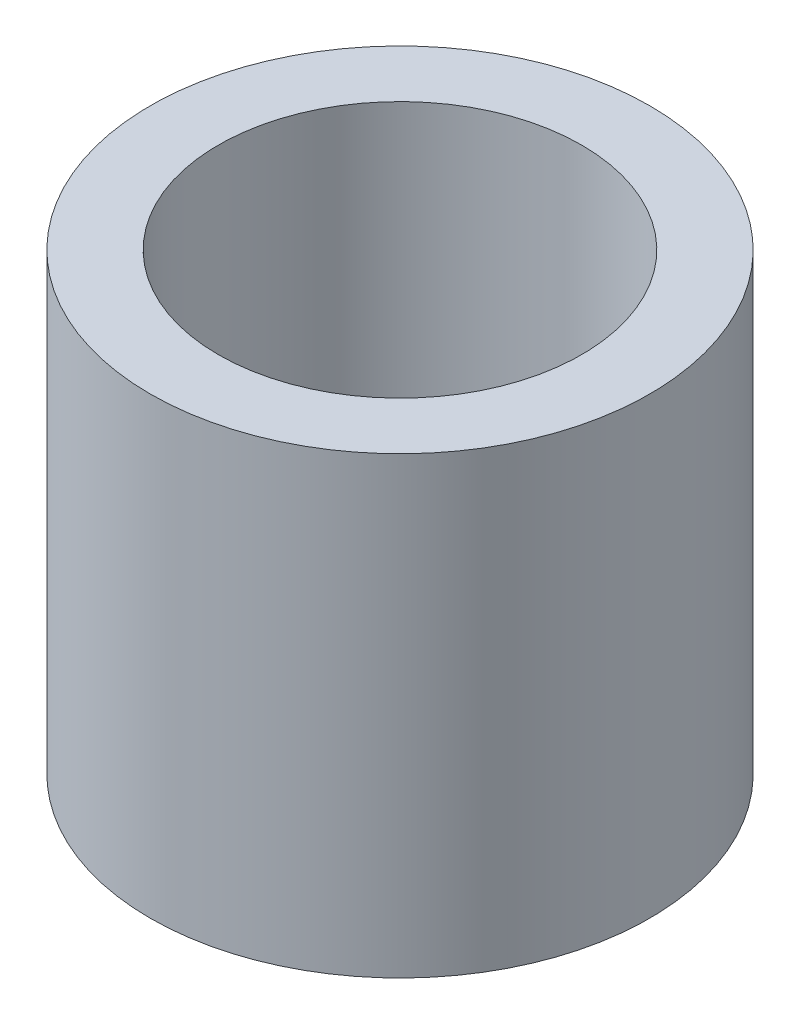
ISO-10303-21;
HEADER;
FILE_DESCRIPTION(('STEP AP214'),'2;1');
FILE_NAME('part.step','',(''),(''),'','','');
FILE_SCHEMA(('AUTOMOTIVE_DESIGN { 1 0 10303 214 1 1 1 1 }'));
ENDSEC;
DATA;
#1=APPLICATION_CONTEXT('core data for automotive mechanical design processes');
#2=APPLICATION_PROTOCOL_DEFINITION('international standard','automotive_design',2000,#1);
#3=PRODUCT_CONTEXT('',#1,'mechanical');
#4=PRODUCT('Part','Part','',(#3));
#5=PRODUCT_RELATED_PRODUCT_CATEGORY('part','',(#4));
#6=PRODUCT_DEFINITION_FORMATION('','',#4);
#7=PRODUCT_DEFINITION_CONTEXT('part definition',#1,'design');
#8=PRODUCT_DEFINITION('design','',#6,#7);
#9=PRODUCT_DEFINITION_SHAPE('','',#8);
#10=(LENGTH_UNIT() NAMED_UNIT(*) SI_UNIT(.MILLI.,.METRE.));
#11=(NAMED_UNIT(*) PLANE_ANGLE_UNIT() SI_UNIT($,.RADIAN.));
#12=(NAMED_UNIT(*) SI_UNIT($,.STERADIAN.) SOLID_ANGLE_UNIT());
#13=UNCERTAINTY_MEASURE_WITH_UNIT(LENGTH_MEASURE(1.E-05),#10,'distance_accuracy_value','');
#14=(GEOMETRIC_REPRESENTATION_CONTEXT(3) GLOBAL_UNCERTAINTY_ASSIGNED_CONTEXT((#13)) GLOBAL_UNIT_ASSIGNED_CONTEXT((#10,
#11,#12)) REPRESENTATION_CONTEXT('',''));
#15=CARTESIAN_POINT('',(0.,0.,0.));
#16=DIRECTION('',(0.,0.,1.));
#17=DIRECTION('',(1.,0.,0.));
#18=AXIS2_PLACEMENT_3D('',#15,#16,#17);
#19=CARTESIAN_POINT('',(0.,10.,0.));
#20=DIRECTION('',(0.,1.,0.));
#21=DIRECTION('',(0.,0.,1.));
#22=AXIS2_PLACEMENT_3D('',#19,#20,#21);
#23=PLANE('',#22);
#24=CARTESIAN_POINT('',(0.,10.,0.));
#25=DIRECTION('',(0.,1.,0.));
#26=DIRECTION('',(0.,0.,1.));
#27=AXIS2_PLACEMENT_3D('',#24,#25,#26);
#28=CIRCLE('',#27,5.5);
#29=CARTESIAN_POINT('',(0.,10.,5.5));
#30=VERTEX_POINT('',#29);
#31=EDGE_CURVE('E10',#30,#30,#28,.T.);
#32=ORIENTED_EDGE('',*,*,#31,.T.);
#33=EDGE_LOOP('',(#32));
#34=FACE_BOUND('',#33,.T.);
#35=CARTESIAN_POINT('',(0.,10.,0.));
#36=DIRECTION('',(0.,1.,0.));
#37=DIRECTION('',(0.,0.,1.));
#38=AXIS2_PLACEMENT_3D('',#35,#36,#37);
#39=CIRCLE('',#38,4.);
#40=CARTESIAN_POINT('',(0.,10.,4.));
#41=VERTEX_POINT('',#40);
#42=EDGE_CURVE('E50',#41,#41,#39,.T.);
#43=ORIENTED_EDGE('',*,*,#42,.F.);
#44=EDGE_LOOP('',(#43));
#45=FACE_BOUND('',#44,.T.);
#46=ADVANCED_FACE('F37',(#34,#45),#23,.T.);
#47=CARTESIAN_POINT('',(0.,0.,0.));
#48=DIRECTION('',(0.,1.,0.));
#49=DIRECTION('',(0.,0.,1.));
#50=AXIS2_PLACEMENT_3D('',#47,#48,#49);
#51=PLANE('',#50);
#52=CARTESIAN_POINT('',(0.,0.,0.));
#53=DIRECTION('',(0.,1.,0.));
#54=DIRECTION('',(0.,0.,1.));
#55=AXIS2_PLACEMENT_3D('',#52,#53,#54);
#56=CIRCLE('',#55,5.5);
#57=CARTESIAN_POINT('',(0.,0.,5.5));
#58=VERTEX_POINT('',#57);
#59=EDGE_CURVE('E41',#58,#58,#56,.T.);
#60=ORIENTED_EDGE('',*,*,#59,.F.);
#61=EDGE_LOOP('',(#60));
#62=FACE_BOUND('',#61,.T.);
#63=CARTESIAN_POINT('',(0.,0.,0.));
#64=DIRECTION('',(0.,1.,0.));
#65=DIRECTION('',(0.,0.,1.));
#66=AXIS2_PLACEMENT_3D('',#63,#64,#65);
#67=CIRCLE('',#66,4.);
#68=CARTESIAN_POINT('',(0.,0.,4.));
#69=VERTEX_POINT('',#68);
#70=EDGE_CURVE('E52',#69,#69,#67,.T.);
#71=ORIENTED_EDGE('',*,*,#70,.T.);
#72=EDGE_LOOP('',(#71));
#73=FACE_BOUND('',#72,.T.);
#74=ADVANCED_FACE('F64',(#62,#73),#51,.F.);
#75=CARTESIAN_POINT('',(0.,10.,0.));
#76=DIRECTION('',(0.,-1.,0.));
#77=DIRECTION('',(0.,0.,-1.));
#78=AXIS2_PLACEMENT_3D('',#75,#76,#77);
#79=CYLINDRICAL_SURFACE('',#78,5.5);
#80=ORIENTED_EDGE('',*,*,#31,.F.);
#81=EDGE_LOOP('',(#80));
#82=FACE_BOUND('',#81,.T.);
#83=ORIENTED_EDGE('',*,*,#59,.T.);
#84=EDGE_LOOP('',(#83));
#85=FACE_BOUND('',#84,.T.);
#86=ADVANCED_FACE('F39',(#82,#85),#79,.T.);
#87=CARTESIAN_POINT('',(0.,10.,0.));
#88=DIRECTION('',(0.,-1.,0.));
#89=DIRECTION('',(0.,0.,-1.));
#90=AXIS2_PLACEMENT_3D('',#87,#88,#89);
#91=CYLINDRICAL_SURFACE('',#90,4.);
#92=ORIENTED_EDGE('',*,*,#42,.T.);
#93=EDGE_LOOP('',(#92));
#94=FACE_BOUND('',#93,.T.);
#95=ORIENTED_EDGE('',*,*,#70,.F.);
#96=EDGE_LOOP('',(#95));
#97=FACE_BOUND('',#96,.T.);
#98=ADVANCED_FACE('F60',(#94,#97),#91,.F.);
#99=CLOSED_SHELL('',(#46,#74,#86,#98));
#100=MANIFOLD_SOLID_BREP('B2',#99);
#101=ADVANCED_BREP_SHAPE_REPRESENTATION('',(#18,#100),#14);
#102=SHAPE_DEFINITION_REPRESENTATION(#9,#101);
ENDSEC;
END-ISO-10303-21;
